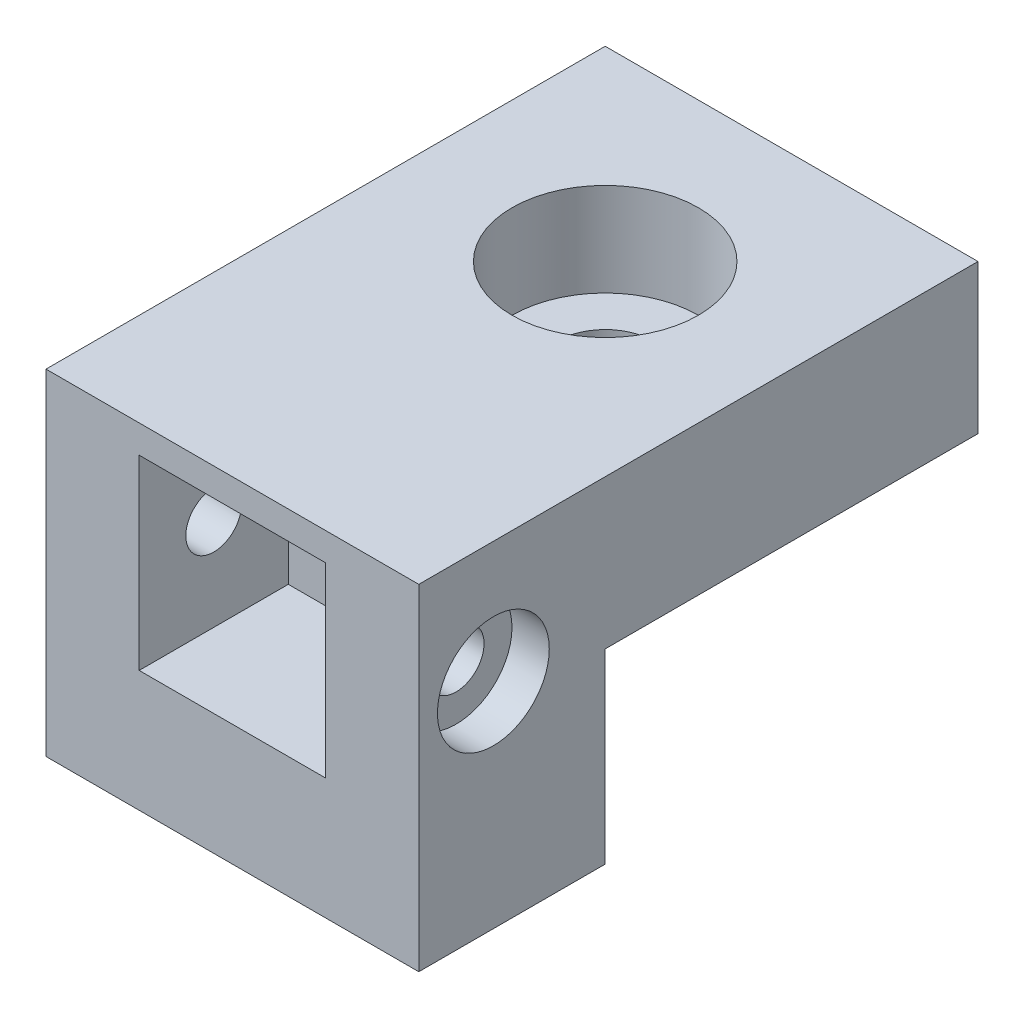
ISO-10303-21;
HEADER;
FILE_DESCRIPTION(('STEP AP214'),'2;1');
FILE_NAME('part.step','',(''),(''),'','','');
FILE_SCHEMA(('AUTOMOTIVE_DESIGN { 1 0 10303 214 1 1 1 1 }'));
ENDSEC;
DATA;
#1=APPLICATION_CONTEXT('core data for automotive mechanical design processes');
#2=APPLICATION_PROTOCOL_DEFINITION('international standard','automotive_design',2000,#1);
#3=PRODUCT_CONTEXT('',#1,'mechanical');
#4=PRODUCT('Part','Part','',(#3));
#5=PRODUCT_RELATED_PRODUCT_CATEGORY('part','',(#4));
#6=PRODUCT_DEFINITION_FORMATION('','',#4);
#7=PRODUCT_DEFINITION_CONTEXT('part definition',#1,'design');
#8=PRODUCT_DEFINITION('design','',#6,#7);
#9=PRODUCT_DEFINITION_SHAPE('','',#8);
#10=(LENGTH_UNIT() NAMED_UNIT(*) SI_UNIT(.MILLI.,.METRE.));
#11=(NAMED_UNIT(*) PLANE_ANGLE_UNIT() SI_UNIT($,.RADIAN.));
#12=(NAMED_UNIT(*) SI_UNIT($,.STERADIAN.) SOLID_ANGLE_UNIT());
#13=UNCERTAINTY_MEASURE_WITH_UNIT(LENGTH_MEASURE(1.E-05),#10,'distance_accuracy_value','');
#14=(GEOMETRIC_REPRESENTATION_CONTEXT(3) GLOBAL_UNCERTAINTY_ASSIGNED_CONTEXT((#13)) GLOBAL_UNIT_ASSIGNED_CONTEXT((#10,
#11,#12)) REPRESENTATION_CONTEXT('',''));
#15=CARTESIAN_POINT('',(0.,0.,0.));
#16=DIRECTION('',(0.,0.,1.));
#17=DIRECTION('',(1.,0.,0.));
#18=AXIS2_PLACEMENT_3D('',#15,#16,#17);
#19=CARTESIAN_POINT('',(20.,1.5,6.));
#20=DIRECTION('',(-1.,0.,0.));
#21=DIRECTION('',(0.,0.,1.));
#22=AXIS2_PLACEMENT_3D('',#19,#20,#21);
#23=CYLINDRICAL_SURFACE('',#22,1.5);
#24=CARTESIAN_POINT('',(15.,1.5,6.));
#25=DIRECTION('',(1.,0.,0.));
#26=DIRECTION('',(0.,0.,-1.));
#27=AXIS2_PLACEMENT_3D('',#24,#25,#26);
#28=CIRCLE('',#27,1.5);
#29=CARTESIAN_POINT('',(15.,1.5,4.5));
#30=VERTEX_POINT('',#29);
#31=EDGE_CURVE('E195',#30,#30,#28,.T.);
#32=ORIENTED_EDGE('',*,*,#31,.F.);
#33=EDGE_LOOP('',(#32));
#34=FACE_BOUND('',#33,.T.);
#35=CARTESIAN_POINT('',(18.,1.5,6.));
#36=DIRECTION('',(1.,0.,0.));
#37=DIRECTION('',(0.,0.,-1.));
#38=AXIS2_PLACEMENT_3D('',#35,#36,#37);
#39=CIRCLE('',#38,1.5);
#40=CARTESIAN_POINT('',(18.,1.5,4.5));
#41=VERTEX_POINT('',#40);
#42=EDGE_CURVE('E66',#41,#41,#39,.F.);
#43=ORIENTED_EDGE('',*,*,#42,.F.);
#44=EDGE_LOOP('',(#43));
#45=FACE_BOUND('',#44,.T.);
#46=ADVANCED_FACE('F62',(#34,#45),#23,.F.);
#47=CARTESIAN_POINT('',(5.,1.5,6.));
#48=DIRECTION('',(1.,0.,0.));
#49=DIRECTION('',(0.,0.,-1.));
#50=AXIS2_PLACEMENT_3D('',#47,#48,#49);
#51=CIRCLE('',#50,1.5);
#52=CARTESIAN_POINT('',(5.,1.5,4.5));
#53=VERTEX_POINT('',#52);
#54=EDGE_CURVE('E192',#53,#53,#51,.T.);
#55=ORIENTED_EDGE('',*,*,#54,.T.);
#56=EDGE_LOOP('',(#55));
#57=FACE_BOUND('',#56,.T.);
#58=CARTESIAN_POINT('',(2.,1.5,6.));
#59=DIRECTION('',(-1.,0.,0.));
#60=DIRECTION('',(0.,0.,1.));
#61=AXIS2_PLACEMENT_3D('',#58,#59,#60);
#62=CIRCLE('',#61,1.5);
#63=CARTESIAN_POINT('',(2.,1.5,7.5));
#64=VERTEX_POINT('',#63);
#65=EDGE_CURVE('E188',#64,#64,#62,.F.);
#66=ORIENTED_EDGE('',*,*,#65,.F.);
#67=EDGE_LOOP('',(#66));
#68=FACE_BOUND('',#67,.T.);
#69=ADVANCED_FACE('F256',(#57,#68),#23,.F.);
#70=CARTESIAN_POINT('',(0.,8.,0.));
#71=DIRECTION('',(1.,0.,0.));
#72=DIRECTION('',(0.,0.,-1.));
#73=AXIS2_PLACEMENT_3D('',#70,#71,#72);
#74=PLANE('',#73);
#75=CARTESIAN_POINT('',(0.,1.5,6.));
#76=DIRECTION('',(-1.,0.,0.));
#77=DIRECTION('',(0.,0.,1.));
#78=AXIS2_PLACEMENT_3D('',#75,#76,#77);
#79=CIRCLE('',#78,3.);
#80=CARTESIAN_POINT('',(0.,1.5,9.));
#81=VERTEX_POINT('',#80);
#82=EDGE_CURVE('E189',#81,#81,#79,.T.);
#83=ORIENTED_EDGE('',*,*,#82,.F.);
#84=EDGE_LOOP('',(#83));
#85=FACE_BOUND('',#84,.T.);
#86=DIRECTION('',(0.,0.,1.));
#87=VECTOR('',#86,1.);
#88=CARTESIAN_POINT('',(0.,8.,0.));
#89=LINE('',#88,#87);
#90=CARTESIAN_POINT('',(0.,8.,-20.));
#91=VERTEX_POINT('',#90);
#92=CARTESIAN_POINT('',(0.,8.,10.));
#93=VERTEX_POINT('',#92);
#94=EDGE_CURVE('E71',#91,#93,#89,.T.);
#95=ORIENTED_EDGE('',*,*,#94,.F.);
#96=DIRECTION('',(0.,-1.,0.));
#97=VECTOR('',#96,1.);
#98=CARTESIAN_POINT('',(0.,15.,-20.));
#99=LINE('',#98,#97);
#100=CARTESIAN_POINT('',(0.,0.,-20.));
#101=VERTEX_POINT('',#100);
#102=EDGE_CURVE('E172',#91,#101,#99,.T.);
#103=ORIENTED_EDGE('',*,*,#102,.T.);
#104=DIRECTION('',(0.,0.,1.));
#105=VECTOR('',#104,1.);
#106=CARTESIAN_POINT('',(0.,0.,0.));
#107=LINE('',#106,#105);
#108=CARTESIAN_POINT('',(0.,0.,0.));
#109=VERTEX_POINT('',#108);
#110=EDGE_CURVE('E237',#101,#109,#107,.T.);
#111=ORIENTED_EDGE('',*,*,#110,.T.);
#112=DIRECTION('',(0.,-1.,0.));
#113=VECTOR('',#112,1.);
#114=CARTESIAN_POINT('',(0.,8.,0.));
#115=LINE('',#114,#113);
#116=CARTESIAN_POINT('',(0.,-10.,0.));
#117=VERTEX_POINT('',#116);
#118=EDGE_CURVE('E166',#109,#117,#115,.T.);
#119=ORIENTED_EDGE('',*,*,#118,.T.);
#120=DIRECTION('',(0.,0.,-1.));
#121=VECTOR('',#120,1.);
#122=CARTESIAN_POINT('',(0.,-10.,10.));
#123=LINE('',#122,#121);
#124=CARTESIAN_POINT('',(0.,-10.,10.));
#125=VERTEX_POINT('',#124);
#126=EDGE_CURVE('E159',#125,#117,#123,.T.);
#127=ORIENTED_EDGE('',*,*,#126,.F.);
#128=DIRECTION('',(0.,-1.,0.));
#129=VECTOR('',#128,1.);
#130=CARTESIAN_POINT('',(0.,0.,10.));
#131=LINE('',#130,#129);
#132=EDGE_CURVE('E142',#93,#125,#131,.T.);
#133=ORIENTED_EDGE('',*,*,#132,.F.);
#134=EDGE_LOOP('',(#95,#103,#111,#119,#127,#133));
#135=FACE_BOUND('',#134,.T.);
#136=ADVANCED_FACE('F64',(#85,#135),#74,.F.);
#137=CARTESIAN_POINT('',(20.,8.,0.));
#138=DIRECTION('',(-1.,0.,0.));
#139=DIRECTION('',(0.,0.,1.));
#140=AXIS2_PLACEMENT_3D('',#137,#138,#139);
#141=PLANE('',#140);
#142=CARTESIAN_POINT('',(20.,1.5,6.));
#143=DIRECTION('',(1.,0.,0.));
#144=DIRECTION('',(0.,0.,-1.));
#145=AXIS2_PLACEMENT_3D('',#142,#143,#144);
#146=CIRCLE('',#145,3.);
#147=CARTESIAN_POINT('',(20.,1.5,3.));
#148=VERTEX_POINT('',#147);
#149=EDGE_CURVE('E179',#148,#148,#146,.T.);
#150=ORIENTED_EDGE('',*,*,#149,.F.);
#151=EDGE_LOOP('',(#150));
#152=FACE_BOUND('',#151,.T.);
#153=DIRECTION('',(0.,0.,-1.));
#154=VECTOR('',#153,1.);
#155=CARTESIAN_POINT('',(20.,0.,0.));
#156=LINE('',#155,#154);
#157=CARTESIAN_POINT('',(20.,0.,0.));
#158=VERTEX_POINT('',#157);
#159=CARTESIAN_POINT('',(20.,0.,-20.));
#160=VERTEX_POINT('',#159);
#161=EDGE_CURVE('E245',#158,#160,#156,.T.);
#162=ORIENTED_EDGE('',*,*,#161,.T.);
#163=DIRECTION('',(0.,-1.,0.));
#164=VECTOR('',#163,1.);
#165=CARTESIAN_POINT('',(20.,15.,-20.));
#166=LINE('',#165,#164);
#167=CARTESIAN_POINT('',(20.,8.,-20.));
#168=VERTEX_POINT('',#167);
#169=EDGE_CURVE('E87',#168,#160,#166,.T.);
#170=ORIENTED_EDGE('',*,*,#169,.F.);
#171=DIRECTION('',(0.,0.,-1.));
#172=VECTOR('',#171,1.);
#173=CARTESIAN_POINT('',(20.,8.,0.));
#174=LINE('',#173,#172);
#175=CARTESIAN_POINT('',(20.,8.,10.));
#176=VERTEX_POINT('',#175);
#177=EDGE_CURVE('E12',#176,#168,#174,.T.);
#178=ORIENTED_EDGE('',*,*,#177,.F.);
#179=DIRECTION('',(0.,-1.,0.));
#180=VECTOR('',#179,1.);
#181=CARTESIAN_POINT('',(20.,0.,10.));
#182=LINE('',#181,#180);
#183=CARTESIAN_POINT('',(20.,-10.,10.));
#184=VERTEX_POINT('',#183);
#185=EDGE_CURVE('E152',#176,#184,#182,.T.);
#186=ORIENTED_EDGE('',*,*,#185,.T.);
#187=DIRECTION('',(0.,0.,-1.));
#188=VECTOR('',#187,1.);
#189=CARTESIAN_POINT('',(20.,-10.,10.));
#190=LINE('',#189,#188);
#191=CARTESIAN_POINT('',(20.,-10.,0.));
#192=VERTEX_POINT('',#191);
#193=EDGE_CURVE('E161',#184,#192,#190,.T.);
#194=ORIENTED_EDGE('',*,*,#193,.T.);
#195=DIRECTION('',(0.,-1.,0.));
#196=VECTOR('',#195,1.);
#197=CARTESIAN_POINT('',(20.,8.,0.));
#198=LINE('',#197,#196);
#199=EDGE_CURVE('E235',#158,#192,#198,.T.);
#200=ORIENTED_EDGE('',*,*,#199,.F.);
#201=EDGE_LOOP('',(#162,#170,#178,#186,#194,#200));
#202=FACE_BOUND('',#201,.T.);
#203=ADVANCED_FACE('F264',(#152,#202),#141,.F.);
#204=CARTESIAN_POINT('',(0.,8.,0.));
#205=DIRECTION('',(0.,-1.,0.));
#206=DIRECTION('',(0.,0.,-1.));
#207=AXIS2_PLACEMENT_3D('',#204,#205,#206);
#208=PLANE('',#207);
#209=CARTESIAN_POINT('',(10.,8.,-10.));
#210=DIRECTION('',(0.,1.,0.));
#211=DIRECTION('',(0.,0.,1.));
#212=AXIS2_PLACEMENT_3D('',#209,#210,#211);
#213=CIRCLE('',#212,5.);
#214=CARTESIAN_POINT('',(10.,8.,-5.));
#215=VERTEX_POINT('',#214);
#216=EDGE_CURVE('E229',#215,#215,#213,.T.);
#217=ORIENTED_EDGE('',*,*,#216,.F.);
#218=EDGE_LOOP('',(#217));
#219=FACE_BOUND('',#218,.T.);
#220=ORIENTED_EDGE('',*,*,#177,.T.);
#221=DIRECTION('',(-1.,0.,0.));
#222=VECTOR('',#221,1.);
#223=CARTESIAN_POINT('',(0.,8.,-20.));
#224=LINE('',#223,#222);
#225=EDGE_CURVE('E175',#168,#91,#224,.T.);
#226=ORIENTED_EDGE('',*,*,#225,.T.);
#227=ORIENTED_EDGE('',*,*,#94,.T.);
#228=DIRECTION('',(-1.,0.,0.));
#229=VECTOR('',#228,1.);
#230=CARTESIAN_POINT('',(20.,8.,10.));
#231=LINE('',#230,#229);
#232=EDGE_CURVE('E148',#176,#93,#231,.T.);
#233=ORIENTED_EDGE('',*,*,#232,.F.);
#234=EDGE_LOOP('',(#220,#226,#227,#233));
#235=FACE_BOUND('',#234,.T.);
#236=ADVANCED_FACE('F310',(#219,#235),#208,.F.);
#237=CARTESIAN_POINT('',(0.,0.,0.));
#238=DIRECTION('',(0.,-1.,0.));
#239=DIRECTION('',(0.,0.,-1.));
#240=AXIS2_PLACEMENT_3D('',#237,#238,#239);
#241=PLANE('',#240);
#242=CARTESIAN_POINT('',(10.,0.,-10.));
#243=DIRECTION('',(0.,-1.,0.));
#244=DIRECTION('',(0.,0.,-1.));
#245=AXIS2_PLACEMENT_3D('',#242,#243,#244);
#246=CIRCLE('',#245,2.6);
#247=CARTESIAN_POINT('',(10.,0.,-7.4));
#248=VERTEX_POINT('',#247);
#249=EDGE_CURVE('E226',#248,#248,#246,.T.);
#250=ORIENTED_EDGE('',*,*,#249,.F.);
#251=EDGE_LOOP('',(#250));
#252=FACE_BOUND('',#251,.T.);
#253=ORIENTED_EDGE('',*,*,#110,.F.);
#254=DIRECTION('',(-1.,0.,0.));
#255=VECTOR('',#254,1.);
#256=CARTESIAN_POINT('',(0.,0.,-20.));
#257=LINE('',#256,#255);
#258=EDGE_CURVE('E239',#160,#101,#257,.T.);
#259=ORIENTED_EDGE('',*,*,#258,.F.);
#260=ORIENTED_EDGE('',*,*,#161,.F.);
#261=DIRECTION('',(1.,0.,0.));
#262=VECTOR('',#261,1.);
#263=CARTESIAN_POINT('',(0.,0.,0.));
#264=LINE('',#263,#262);
#265=EDGE_CURVE('E242',#109,#158,#264,.T.);
#266=ORIENTED_EDGE('',*,*,#265,.F.);
#267=EDGE_LOOP('',(#253,#259,#260,#266));
#268=FACE_BOUND('',#267,.T.);
#269=ADVANCED_FACE('F308',(#252,#268),#241,.T.);
#270=CARTESIAN_POINT('',(20.,8.,0.));
#271=DIRECTION('',(0.,0.,-1.));
#272=DIRECTION('',(0.,1.,0.));
#273=AXIS2_PLACEMENT_3D('',#270,#271,#272);
#274=PLANE('',#273);
#275=ORIENTED_EDGE('',*,*,#118,.F.);
#276=ORIENTED_EDGE('',*,*,#265,.T.);
#277=ORIENTED_EDGE('',*,*,#199,.T.);
#278=DIRECTION('',(1.,0.,0.));
#279=VECTOR('',#278,1.);
#280=CARTESIAN_POINT('',(0.,-10.,0.));
#281=LINE('',#280,#279);
#282=EDGE_CURVE('E162',#117,#192,#281,.T.);
#283=ORIENTED_EDGE('',*,*,#282,.F.);
#284=EDGE_LOOP('',(#275,#276,#277,#283));
#285=FACE_BOUND('',#284,.T.);
#286=ADVANCED_FACE('F304',(#285),#274,.T.);
#287=CARTESIAN_POINT('',(10.,3.,-10.));
#288=DIRECTION('',(0.,1.,0.));
#289=DIRECTION('',(0.,0.,1.));
#290=AXIS2_PLACEMENT_3D('',#287,#288,#289);
#291=CYLINDRICAL_SURFACE('',#290,5.);
#292=CARTESIAN_POINT('',(10.,3.,-10.));
#293=DIRECTION('',(0.,1.,0.));
#294=DIRECTION('',(0.,0.,1.));
#295=AXIS2_PLACEMENT_3D('',#292,#293,#294);
#296=CIRCLE('',#295,5.);
#297=CARTESIAN_POINT('',(10.,3.,-5.));
#298=VERTEX_POINT('',#297);
#299=EDGE_CURVE('E230',#298,#298,#296,.T.);
#300=ORIENTED_EDGE('',*,*,#299,.F.);
#301=EDGE_LOOP('',(#300));
#302=FACE_BOUND('',#301,.T.);
#303=ORIENTED_EDGE('',*,*,#216,.T.);
#304=EDGE_LOOP('',(#303));
#305=FACE_BOUND('',#304,.T.);
#306=ADVANCED_FACE('F300',(#302,#305),#291,.F.);
#307=CARTESIAN_POINT('',(0.,3.,0.));
#308=DIRECTION('',(0.,1.,0.));
#309=DIRECTION('',(0.,0.,1.));
#310=AXIS2_PLACEMENT_3D('',#307,#308,#309);
#311=PLANE('',#310);
#312=CARTESIAN_POINT('',(10.,3.,-10.));
#313=DIRECTION('',(0.,1.,0.));
#314=DIRECTION('',(0.,0.,1.));
#315=AXIS2_PLACEMENT_3D('',#312,#313,#314);
#316=CIRCLE('',#315,2.6);
#317=CARTESIAN_POINT('',(10.,3.,-7.4));
#318=VERTEX_POINT('',#317);
#319=EDGE_CURVE('E225',#318,#318,#316,.T.);
#320=ORIENTED_EDGE('',*,*,#319,.F.);
#321=EDGE_LOOP('',(#320));
#322=FACE_BOUND('',#321,.T.);
#323=ORIENTED_EDGE('',*,*,#299,.T.);
#324=EDGE_LOOP('',(#323));
#325=FACE_BOUND('',#324,.T.);
#326=ADVANCED_FACE('F296',(#322,#325),#311,.T.);
#327=CARTESIAN_POINT('',(10.,-5.,-10.));
#328=DIRECTION('',(0.,1.,0.));
#329=DIRECTION('',(0.,0.,1.));
#330=AXIS2_PLACEMENT_3D('',#327,#328,#329);
#331=CYLINDRICAL_SURFACE('',#330,2.6);
#332=CARTESIAN_POINT('',(10.,0.,-7.4));
#333=CARTESIAN_POINT('',(10.,0.0312500000000009,-7.4));
#334=CARTESIAN_POINT('',(10.,0.0625000000000009,-7.4));
#335=CARTESIAN_POINT('',(10.,0.125000000000001,-7.4));
#336=CARTESIAN_POINT('',(10.,0.156250000000001,-7.4));
#337=CARTESIAN_POINT('',(10.,0.218750000000001,-7.4));
#338=CARTESIAN_POINT('',(10.,0.250000000000001,-7.4));
#339=CARTESIAN_POINT('',(10.,0.312500000000001,-7.4));
#340=CARTESIAN_POINT('',(10.,0.343750000000001,-7.4));
#341=CARTESIAN_POINT('',(10.,0.406250000000001,-7.4));
#342=CARTESIAN_POINT('',(10.,0.437500000000001,-7.4));
#343=CARTESIAN_POINT('',(10.,0.5,-7.4));
#344=CARTESIAN_POINT('',(10.,0.53125,-7.4));
#345=CARTESIAN_POINT('',(10.,0.593750000000001,-7.4));
#346=CARTESIAN_POINT('',(10.,0.625000000000001,-7.4));
#347=CARTESIAN_POINT('',(10.,0.687500000000001,-7.4));
#348=CARTESIAN_POINT('',(10.,0.718750000000001,-7.4));
#349=CARTESIAN_POINT('',(10.,0.781250000000001,-7.4));
#350=CARTESIAN_POINT('',(10.,0.812500000000001,-7.4));
#351=CARTESIAN_POINT('',(10.,0.875000000000001,-7.4));
#352=CARTESIAN_POINT('',(10.,0.906250000000001,-7.4));
#353=CARTESIAN_POINT('',(10.,0.968750000000001,-7.4));
#354=CARTESIAN_POINT('',(10.,1.,-7.4));
#355=CARTESIAN_POINT('',(10.,1.0625,-7.4));
#356=CARTESIAN_POINT('',(10.,1.09375,-7.4));
#357=CARTESIAN_POINT('',(10.,1.15625,-7.4));
#358=CARTESIAN_POINT('',(10.,1.1875,-7.4));
#359=CARTESIAN_POINT('',(10.,1.25,-7.4));
#360=CARTESIAN_POINT('',(10.,1.28125,-7.4));
#361=CARTESIAN_POINT('',(10.,1.34375,-7.4));
#362=CARTESIAN_POINT('',(10.,1.375,-7.4));
#363=CARTESIAN_POINT('',(10.,1.4375,-7.4));
#364=CARTESIAN_POINT('',(10.,1.46875,-7.4));
#365=CARTESIAN_POINT('',(10.,1.53125,-7.4));
#366=CARTESIAN_POINT('',(10.,1.5625,-7.4));
#367=CARTESIAN_POINT('',(10.,1.625,-7.4));
#368=CARTESIAN_POINT('',(10.,1.65625,-7.4));
#369=CARTESIAN_POINT('',(10.,1.71875,-7.4));
#370=CARTESIAN_POINT('',(10.,1.75,-7.4));
#371=CARTESIAN_POINT('',(10.,1.8125,-7.4));
#372=CARTESIAN_POINT('',(10.,1.84375,-7.4));
#373=CARTESIAN_POINT('',(10.,1.90625,-7.4));
#374=CARTESIAN_POINT('',(10.,1.9375,-7.4));
#375=CARTESIAN_POINT('',(10.,2.,-7.4));
#376=CARTESIAN_POINT('',(10.,2.03125,-7.4));
#377=CARTESIAN_POINT('',(10.,2.09375,-7.4));
#378=CARTESIAN_POINT('',(10.,2.125,-7.4));
#379=CARTESIAN_POINT('',(10.,2.1875,-7.4));
#380=CARTESIAN_POINT('',(10.,2.21875,-7.4));
#381=CARTESIAN_POINT('',(10.,2.28125,-7.4));
#382=CARTESIAN_POINT('',(10.,2.3125,-7.4));
#383=CARTESIAN_POINT('',(10.,2.375,-7.4));
#384=CARTESIAN_POINT('',(10.,2.40625,-7.4));
#385=CARTESIAN_POINT('',(10.,2.46875,-7.4));
#386=CARTESIAN_POINT('',(10.,2.5,-7.4));
#387=CARTESIAN_POINT('',(10.,2.5625,-7.4));
#388=CARTESIAN_POINT('',(10.,2.59375,-7.4));
#389=CARTESIAN_POINT('',(10.,2.65625,-7.4));
#390=CARTESIAN_POINT('',(10.,2.6875,-7.4));
#391=CARTESIAN_POINT('',(10.,2.75,-7.4));
#392=CARTESIAN_POINT('',(10.,2.78125,-7.4));
#393=CARTESIAN_POINT('',(10.,2.84375,-7.4));
#394=CARTESIAN_POINT('',(10.,2.875,-7.4));
#395=CARTESIAN_POINT('',(10.,2.9375,-7.4));
#396=CARTESIAN_POINT('',(10.,2.96875,-7.4));
#397=CARTESIAN_POINT('',(10.,3.,-7.4));
#398=B_SPLINE_CURVE_WITH_KNOTS('',3,(#332,#333,#334,#335,#336,#337,#338,#339,#340,#341,#342,
#343,#344,#345,#346,#347,#348,#349,#350,#351,#352,#353,#354,#355,#356,#357,#358,#359,#360,#361,
#362,#363,#364,#365,#366,#367,#368,#369,#370,#371,#372,#373,#374,#375,#376,#377,#378,#379,#380,
#381,#382,#383,#384,#385,#386,#387,#388,#389,#390,#391,#392,#393,#394,#395,#396,#397),
.UNSPECIFIED.,.F.,.F.,(4,2,2,2,2,2,2,2,2,2,2,2,2,2,2,2,2,2,2,2,2,2,2,2,2,2,2,2,2,2,2,2,4),(0.,
0.0937500000000001,0.1875,0.28125,0.375,0.46875,0.5625,0.65625,0.75,0.84375,0.9375,1.03125,
1.125,1.21875,1.3125,1.40625,1.5,1.59375,1.6875,1.78125,1.875,1.96875,2.0625,2.15625,2.25,
2.34375,2.4375,2.53125,2.625,2.71875,2.8125,2.90625,3.),.UNSPECIFIED.);
#399=EDGE_CURVE('BSEAM292',#248,#318,#398,.T.);
#400=ORIENTED_EDGE('',*,*,#249,.T.);
#401=ORIENTED_EDGE('',*,*,#319,.T.);
#402=ORIENTED_EDGE('',*,*,#399,.T.);
#403=ORIENTED_EDGE('',*,*,#399,.F.);
#404=EDGE_LOOP('',(#400,#402,#401,#403));
#405=FACE_BOUND('',#404,.T.);
#406=ADVANCED_FACE('F292',(#405),#331,.F.);
#407=CARTESIAN_POINT('',(0.,0.,10.));
#408=DIRECTION('',(0.,0.,1.));
#409=DIRECTION('',(1.,0.,0.));
#410=AXIS2_PLACEMENT_3D('',#407,#408,#409);
#411=PLANE('',#410);
#412=DIRECTION('',(1.,0.,0.));
#413=VECTOR('',#412,1.);
#414=CARTESIAN_POINT('',(0.,-3.5,10.));
#415=LINE('',#414,#413);
#416=CARTESIAN_POINT('',(5.,-3.5,10.));
#417=VERTEX_POINT('',#416);
#418=CARTESIAN_POINT('',(15.,-3.5,10.));
#419=VERTEX_POINT('',#418);
#420=EDGE_CURVE('E79',#417,#419,#415,.T.);
#421=ORIENTED_EDGE('',*,*,#420,.F.);
#422=DIRECTION('',(0.,1.,0.));
#423=VECTOR('',#422,1.);
#424=CARTESIAN_POINT('',(5.,0.,10.));
#425=LINE('',#424,#423);
#426=CARTESIAN_POINT('',(5.,6.5,10.));
#427=VERTEX_POINT('',#426);
#428=EDGE_CURVE('E200',#417,#427,#425,.T.);
#429=ORIENTED_EDGE('',*,*,#428,.T.);
#430=DIRECTION('',(1.,0.,0.));
#431=VECTOR('',#430,1.);
#432=CARTESIAN_POINT('',(0.,6.5,10.));
#433=LINE('',#432,#431);
#434=CARTESIAN_POINT('',(15.,6.5,10.));
#435=VERTEX_POINT('',#434);
#436=EDGE_CURVE('E212',#427,#435,#433,.T.);
#437=ORIENTED_EDGE('',*,*,#436,.T.);
#438=DIRECTION('',(0.,1.,0.));
#439=VECTOR('',#438,1.);
#440=CARTESIAN_POINT('',(15.,0.,10.));
#441=LINE('',#440,#439);
#442=EDGE_CURVE('E209',#419,#435,#441,.T.);
#443=ORIENTED_EDGE('',*,*,#442,.F.);
#444=EDGE_LOOP('',(#421,#429,#437,#443));
#445=FACE_BOUND('',#444,.T.);
#446=ORIENTED_EDGE('',*,*,#132,.T.);
#447=DIRECTION('',(1.,0.,0.));
#448=VECTOR('',#447,1.);
#449=CARTESIAN_POINT('',(0.,-10.,10.));
#450=LINE('',#449,#448);
#451=EDGE_CURVE('E145',#125,#184,#450,.T.);
#452=ORIENTED_EDGE('',*,*,#451,.T.);
#453=ORIENTED_EDGE('',*,*,#185,.F.);
#454=ORIENTED_EDGE('',*,*,#232,.T.);
#455=EDGE_LOOP('',(#446,#452,#453,#454));
#456=FACE_BOUND('',#455,.T.);
#457=ADVANCED_FACE('F144',(#445,#456),#411,.T.);
#458=CARTESIAN_POINT('',(0.,-3.5,2.));
#459=DIRECTION('',(0.,-1.,0.));
#460=DIRECTION('',(0.,0.,-1.));
#461=AXIS2_PLACEMENT_3D('',#458,#459,#460);
#462=PLANE('',#461);
#463=ORIENTED_EDGE('',*,*,#420,.T.);
#464=DIRECTION('',(0.,0.,1.));
#465=VECTOR('',#464,1.);
#466=CARTESIAN_POINT('',(15.,-3.5,2.));
#467=LINE('',#466,#465);
#468=CARTESIAN_POINT('',(15.,-3.5,2.));
#469=VERTEX_POINT('',#468);
#470=EDGE_CURVE('E207',#469,#419,#467,.T.);
#471=ORIENTED_EDGE('',*,*,#470,.F.);
#472=DIRECTION('',(1.,0.,0.));
#473=VECTOR('',#472,1.);
#474=CARTESIAN_POINT('',(0.,-3.5,2.));
#475=LINE('',#474,#473);
#476=CARTESIAN_POINT('',(5.,-3.5,2.));
#477=VERTEX_POINT('',#476);
#478=EDGE_CURVE('E196',#477,#469,#475,.T.);
#479=ORIENTED_EDGE('',*,*,#478,.F.);
#480=DIRECTION('',(0.,0.,1.));
#481=VECTOR('',#480,1.);
#482=CARTESIAN_POINT('',(5.,-3.5,2.));
#483=LINE('',#482,#481);
#484=EDGE_CURVE('E153',#477,#417,#483,.T.);
#485=ORIENTED_EDGE('',*,*,#484,.T.);
#486=EDGE_LOOP('',(#463,#471,#479,#485));
#487=FACE_BOUND('',#486,.T.);
#488=ADVANCED_FACE('F280',(#487),#462,.F.);
#489=CARTESIAN_POINT('',(5.,0.,2.));
#490=DIRECTION('',(1.,0.,0.));
#491=DIRECTION('',(0.,0.,-1.));
#492=AXIS2_PLACEMENT_3D('',#489,#490,#491);
#493=PLANE('',#492);
#494=ORIENTED_EDGE('',*,*,#54,.F.);
#495=EDGE_LOOP('',(#494));
#496=FACE_BOUND('',#495,.T.);
#497=ORIENTED_EDGE('',*,*,#428,.F.);
#498=ORIENTED_EDGE('',*,*,#484,.F.);
#499=DIRECTION('',(0.,1.,0.));
#500=VECTOR('',#499,1.);
#501=CARTESIAN_POINT('',(5.,0.,2.));
#502=LINE('',#501,#500);
#503=CARTESIAN_POINT('',(5.,6.5,2.));
#504=VERTEX_POINT('',#503);
#505=EDGE_CURVE('E205',#477,#504,#502,.T.);
#506=ORIENTED_EDGE('',*,*,#505,.T.);
#507=DIRECTION('',(0.,0.,1.));
#508=VECTOR('',#507,1.);
#509=CARTESIAN_POINT('',(5.,6.5,2.));
#510=LINE('',#509,#508);
#511=EDGE_CURVE('E218',#504,#427,#510,.T.);
#512=ORIENTED_EDGE('',*,*,#511,.T.);
#513=EDGE_LOOP('',(#497,#498,#506,#512));
#514=FACE_BOUND('',#513,.T.);
#515=ADVANCED_FACE('F276',(#496,#514),#493,.T.);
#516=CARTESIAN_POINT('',(0.,6.5,2.));
#517=DIRECTION('',(0.,-1.,0.));
#518=DIRECTION('',(0.,0.,-1.));
#519=AXIS2_PLACEMENT_3D('',#516,#517,#518);
#520=PLANE('',#519);
#521=ORIENTED_EDGE('',*,*,#436,.F.);
#522=ORIENTED_EDGE('',*,*,#511,.F.);
#523=DIRECTION('',(1.,0.,0.));
#524=VECTOR('',#523,1.);
#525=CARTESIAN_POINT('',(0.,6.5,2.));
#526=LINE('',#525,#524);
#527=CARTESIAN_POINT('',(15.,6.5,2.));
#528=VERTEX_POINT('',#527);
#529=EDGE_CURVE('E203',#504,#528,#526,.T.);
#530=ORIENTED_EDGE('',*,*,#529,.T.);
#531=DIRECTION('',(0.,0.,1.));
#532=VECTOR('',#531,1.);
#533=CARTESIAN_POINT('',(15.,6.5,2.));
#534=LINE('',#533,#532);
#535=EDGE_CURVE('E220',#528,#435,#534,.T.);
#536=ORIENTED_EDGE('',*,*,#535,.T.);
#537=EDGE_LOOP('',(#521,#522,#530,#536));
#538=FACE_BOUND('',#537,.T.);
#539=ADVANCED_FACE('F279',(#538),#520,.T.);
#540=CARTESIAN_POINT('',(15.,0.,2.));
#541=DIRECTION('',(1.,0.,0.));
#542=DIRECTION('',(0.,0.,-1.));
#543=AXIS2_PLACEMENT_3D('',#540,#541,#542);
#544=PLANE('',#543);
#545=ORIENTED_EDGE('',*,*,#31,.T.);
#546=EDGE_LOOP('',(#545));
#547=FACE_BOUND('',#546,.T.);
#548=ORIENTED_EDGE('',*,*,#442,.T.);
#549=ORIENTED_EDGE('',*,*,#535,.F.);
#550=DIRECTION('',(0.,1.,0.));
#551=VECTOR('',#550,1.);
#552=CARTESIAN_POINT('',(15.,0.,2.));
#553=LINE('',#552,#551);
#554=EDGE_CURVE('E199',#469,#528,#553,.T.);
#555=ORIENTED_EDGE('',*,*,#554,.F.);
#556=ORIENTED_EDGE('',*,*,#470,.T.);
#557=EDGE_LOOP('',(#548,#549,#555,#556));
#558=FACE_BOUND('',#557,.T.);
#559=ADVANCED_FACE('F274',(#547,#558),#544,.F.);
#560=CARTESIAN_POINT('',(0.,0.,2.));
#561=DIRECTION('',(0.,0.,1.));
#562=DIRECTION('',(1.,0.,0.));
#563=AXIS2_PLACEMENT_3D('',#560,#561,#562);
#564=PLANE('',#563);
#565=ORIENTED_EDGE('',*,*,#478,.T.);
#566=ORIENTED_EDGE('',*,*,#554,.T.);
#567=ORIENTED_EDGE('',*,*,#529,.F.);
#568=ORIENTED_EDGE('',*,*,#505,.F.);
#569=EDGE_LOOP('',(#565,#566,#567,#568));
#570=FACE_BOUND('',#569,.T.);
#571=ADVANCED_FACE('F271',(#570),#564,.T.);
#572=CARTESIAN_POINT('',(2.,1.5,6.));
#573=DIRECTION('',(-1.,0.,0.));
#574=DIRECTION('',(0.,0.,1.));
#575=AXIS2_PLACEMENT_3D('',#572,#573,#574);
#576=PLANE('',#575);
#577=CARTESIAN_POINT('',(2.,1.5,6.));
#578=DIRECTION('',(-1.,0.,0.));
#579=DIRECTION('',(0.,0.,1.));
#580=AXIS2_PLACEMENT_3D('',#577,#578,#579);
#581=CIRCLE('',#580,3.);
#582=CARTESIAN_POINT('',(2.,1.5,9.));
#583=VERTEX_POINT('',#582);
#584=EDGE_CURVE('E185',#583,#583,#581,.T.);
#585=ORIENTED_EDGE('',*,*,#584,.T.);
#586=EDGE_LOOP('',(#585));
#587=FACE_BOUND('',#586,.T.);
#588=ORIENTED_EDGE('',*,*,#65,.T.);
#589=EDGE_LOOP('',(#588));
#590=FACE_BOUND('',#589,.T.);
#591=ADVANCED_FACE('F254',(#587,#590),#576,.T.);
#592=CARTESIAN_POINT('',(2.,1.5,6.));
#593=DIRECTION('',(-1.,0.,0.));
#594=DIRECTION('',(0.,0.,1.));
#595=AXIS2_PLACEMENT_3D('',#592,#593,#594);
#596=CYLINDRICAL_SURFACE('',#595,3.);
#597=ORIENTED_EDGE('',*,*,#584,.F.);
#598=EDGE_LOOP('',(#597));
#599=FACE_BOUND('',#598,.T.);
#600=ORIENTED_EDGE('',*,*,#82,.T.);
#601=EDGE_LOOP('',(#600));
#602=FACE_BOUND('',#601,.T.);
#603=ADVANCED_FACE('F269',(#599,#602),#596,.F.);
#604=CARTESIAN_POINT('',(18.,1.5,6.));
#605=DIRECTION('',(1.,0.,0.));
#606=DIRECTION('',(0.,0.,-1.));
#607=AXIS2_PLACEMENT_3D('',#604,#605,#606);
#608=PLANE('',#607);
#609=CARTESIAN_POINT('',(18.,1.5,6.));
#610=DIRECTION('',(1.,0.,0.));
#611=DIRECTION('',(0.,0.,-1.));
#612=AXIS2_PLACEMENT_3D('',#609,#610,#611);
#613=CIRCLE('',#612,3.);
#614=CARTESIAN_POINT('',(18.,1.5,3.));
#615=VERTEX_POINT('',#614);
#616=EDGE_CURVE('E180',#615,#615,#613,.T.);
#617=ORIENTED_EDGE('',*,*,#616,.T.);
#618=EDGE_LOOP('',(#617));
#619=FACE_BOUND('',#618,.T.);
#620=ORIENTED_EDGE('',*,*,#42,.T.);
#621=EDGE_LOOP('',(#620));
#622=FACE_BOUND('',#621,.T.);
#623=ADVANCED_FACE('F337',(#619,#622),#608,.T.);
#624=CARTESIAN_POINT('',(18.,1.5,6.));
#625=DIRECTION('',(1.,0.,0.));
#626=DIRECTION('',(0.,0.,-1.));
#627=AXIS2_PLACEMENT_3D('',#624,#625,#626);
#628=CYLINDRICAL_SURFACE('',#627,3.);
#629=ORIENTED_EDGE('',*,*,#616,.F.);
#630=EDGE_LOOP('',(#629));
#631=FACE_BOUND('',#630,.T.);
#632=ORIENTED_EDGE('',*,*,#149,.T.);
#633=EDGE_LOOP('',(#632));
#634=FACE_BOUND('',#633,.T.);
#635=ADVANCED_FACE('F330',(#631,#634),#628,.F.);
#636=CARTESIAN_POINT('',(0.,15.,-20.));
#637=DIRECTION('',(0.,0.,1.));
#638=DIRECTION('',(1.,0.,0.));
#639=AXIS2_PLACEMENT_3D('',#636,#637,#638);
#640=PLANE('',#639);
#641=ORIENTED_EDGE('',*,*,#169,.T.);
#642=ORIENTED_EDGE('',*,*,#258,.T.);
#643=ORIENTED_EDGE('',*,*,#102,.F.);
#644=ORIENTED_EDGE('',*,*,#225,.F.);
#645=EDGE_LOOP('',(#641,#642,#643,#644));
#646=FACE_BOUND('',#645,.T.);
#647=ADVANCED_FACE('F327',(#646),#640,.F.);
#648=CARTESIAN_POINT('',(0.,-10.,10.));
#649=DIRECTION('',(0.,-1.,0.));
#650=DIRECTION('',(0.,0.,-1.));
#651=AXIS2_PLACEMENT_3D('',#648,#649,#650);
#652=PLANE('',#651);
#653=ORIENTED_EDGE('',*,*,#193,.F.);
#654=ORIENTED_EDGE('',*,*,#451,.F.);
#655=ORIENTED_EDGE('',*,*,#126,.T.);
#656=ORIENTED_EDGE('',*,*,#282,.T.);
#657=EDGE_LOOP('',(#653,#654,#655,#656));
#658=FACE_BOUND('',#657,.T.);
#659=ADVANCED_FACE('F157',(#658),#652,.T.);
#660=CLOSED_SHELL('',(#46,#69,#136,#203,#236,#269,#286,#306,#326,#406,#457,#488,#515,#539,#559,
#571,#591,#603,#623,#635,#647,#659));
#661=MANIFOLD_SOLID_BREP('B2',#660);
#662=ADVANCED_BREP_SHAPE_REPRESENTATION('',(#18,#661),#14);
#663=SHAPE_DEFINITION_REPRESENTATION(#9,#662);
ENDSEC;
END-ISO-10303-21;
